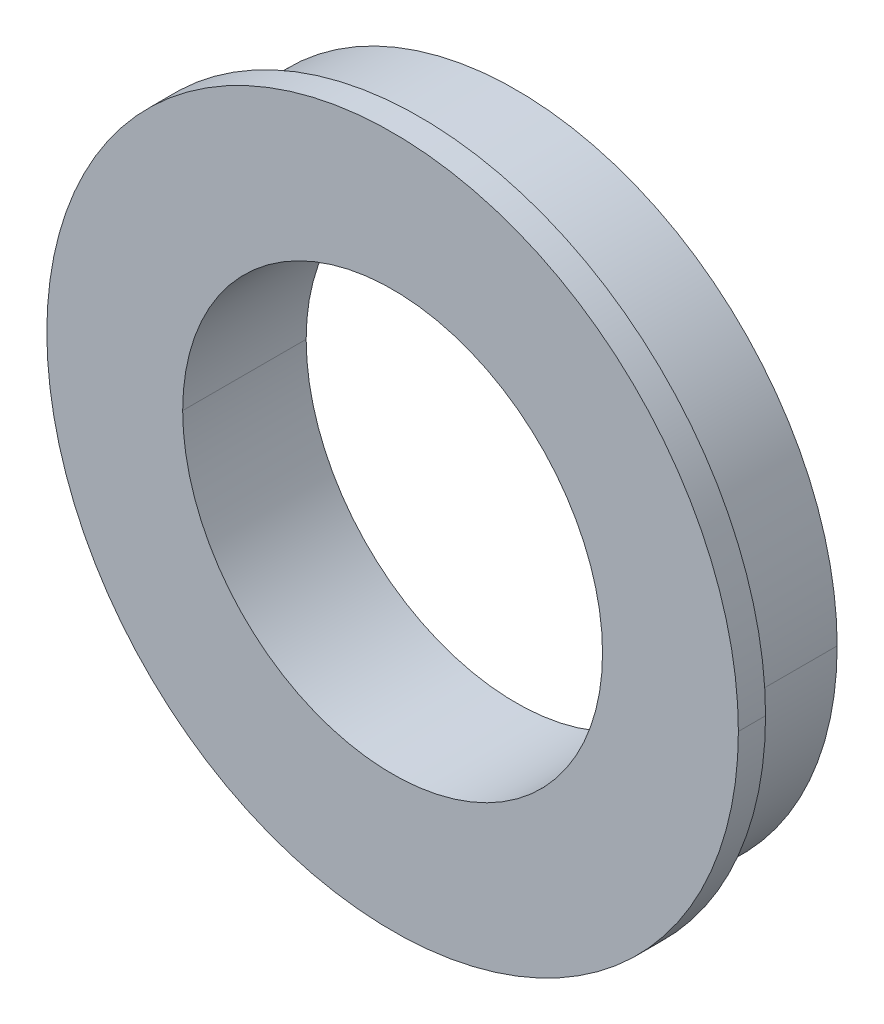
ISO-10303-21;
HEADER;
FILE_DESCRIPTION(('STEP AP214'),'2;1');
FILE_NAME('part.step','',(''),(''),'','','');
FILE_SCHEMA(('AUTOMOTIVE_DESIGN { 1 0 10303 214 1 1 1 1 }'));
ENDSEC;
DATA;
#1=APPLICATION_CONTEXT('core data for automotive mechanical design processes');
#2=APPLICATION_PROTOCOL_DEFINITION('international standard','automotive_design',2000,#1);
#3=PRODUCT_CONTEXT('',#1,'mechanical');
#4=PRODUCT('Part','Part','',(#3));
#5=PRODUCT_RELATED_PRODUCT_CATEGORY('part','',(#4));
#6=PRODUCT_DEFINITION_FORMATION('','',#4);
#7=PRODUCT_DEFINITION_CONTEXT('part definition',#1,'design');
#8=PRODUCT_DEFINITION('design','',#6,#7);
#9=PRODUCT_DEFINITION_SHAPE('','',#8);
#10=(LENGTH_UNIT() NAMED_UNIT(*) SI_UNIT(.MILLI.,.METRE.));
#11=(NAMED_UNIT(*) PLANE_ANGLE_UNIT() SI_UNIT($,.RADIAN.));
#12=(NAMED_UNIT(*) SI_UNIT($,.STERADIAN.) SOLID_ANGLE_UNIT());
#13=UNCERTAINTY_MEASURE_WITH_UNIT(LENGTH_MEASURE(1.E-05),#10,'distance_accuracy_value','');
#14=(GEOMETRIC_REPRESENTATION_CONTEXT(3) GLOBAL_UNCERTAINTY_ASSIGNED_CONTEXT((#13)) GLOBAL_UNIT_ASSIGNED_CONTEXT((#10,
#11,#12)) REPRESENTATION_CONTEXT('',''));
#15=CARTESIAN_POINT('',(0.,0.,0.));
#16=DIRECTION('',(0.,0.,1.));
#17=DIRECTION('',(1.,0.,0.));
#18=AXIS2_PLACEMENT_3D('',#15,#16,#17);
#19=CARTESIAN_POINT('',(0.,0.,3.9));
#20=DIRECTION('',(0.,0.,1.));
#21=DIRECTION('',(1.,0.,0.));
#22=AXIS2_PLACEMENT_3D('',#19,#20,#21);
#23=CYLINDRICAL_SURFACE('',#22,14.);
#24=DIRECTION('',(0.,0.,1.));
#25=VECTOR('',#24,1.);
#26=CARTESIAN_POINT('',(-14.,0.,3.9));
#27=LINE('',#26,#25);
#28=CARTESIAN_POINT('',(-14.,0.,3.9));
#29=VERTEX_POINT('',#28);
#30=CARTESIAN_POINT('',(-14.,0.,5.));
#31=VERTEX_POINT('',#30);
#32=EDGE_CURVE('E134',#29,#31,#27,.T.);
#33=ORIENTED_EDGE('',*,*,#32,.F.);
#34=CARTESIAN_POINT('',(0.,0.,3.9));
#35=DIRECTION('',(0.,0.,1.));
#36=DIRECTION('',(1.,0.,0.));
#37=AXIS2_PLACEMENT_3D('',#34,#35,#36);
#38=CIRCLE('',#37,14.);
#39=CARTESIAN_POINT('',(14.,0.,3.9));
#40=VERTEX_POINT('',#39);
#41=EDGE_CURVE('E9',#29,#40,#38,.T.);
#42=ORIENTED_EDGE('',*,*,#41,.T.);
#43=DIRECTION('',(0.,0.,1.));
#44=VECTOR('',#43,1.);
#45=CARTESIAN_POINT('',(14.,0.,3.9));
#46=LINE('',#45,#44);
#47=CARTESIAN_POINT('',(14.,0.,5.));
#48=VERTEX_POINT('',#47);
#49=EDGE_CURVE('E124',#40,#48,#46,.T.);
#50=ORIENTED_EDGE('',*,*,#49,.T.);
#51=CARTESIAN_POINT('',(0.,0.,5.));
#52=DIRECTION('',(0.,0.,1.));
#53=DIRECTION('',(1.,0.,0.));
#54=AXIS2_PLACEMENT_3D('',#51,#52,#53);
#55=CIRCLE('',#54,14.);
#56=EDGE_CURVE('E90',#31,#48,#55,.T.);
#57=ORIENTED_EDGE('',*,*,#56,.F.);
#58=EDGE_LOOP('',(#33,#42,#50,#57));
#59=FACE_BOUND('',#58,.T.);
#60=ADVANCED_FACE('F15',(#59),#23,.T.);
#61=CARTESIAN_POINT('',(0.,0.,3.9));
#62=DIRECTION('',(0.,0.,1.));
#63=DIRECTION('',(1.,0.,0.));
#64=AXIS2_PLACEMENT_3D('',#61,#62,#63);
#65=PLANE('',#64);
#66=CARTESIAN_POINT('',(0.,0.,3.9));
#67=DIRECTION('',(0.,0.,1.));
#68=DIRECTION('',(1.,0.,0.));
#69=AXIS2_PLACEMENT_3D('',#66,#67,#68);
#70=CIRCLE('',#69,13.);
#71=CARTESIAN_POINT('',(-13.,0.,3.9));
#72=VERTEX_POINT('',#71);
#73=CARTESIAN_POINT('',(13.,0.,3.9));
#74=VERTEX_POINT('',#73);
#75=EDGE_CURVE('E53',#72,#74,#70,.T.);
#76=ORIENTED_EDGE('',*,*,#75,.T.);
#77=CARTESIAN_POINT('',(0.,0.,3.9));
#78=DIRECTION('',(0.,0.,1.));
#79=DIRECTION('',(1.,0.,0.));
#80=AXIS2_PLACEMENT_3D('',#77,#78,#79);
#81=CIRCLE('',#80,13.);
#82=EDGE_CURVE('E67',#74,#72,#81,.T.);
#83=ORIENTED_EDGE('',*,*,#82,.T.);
#84=EDGE_LOOP('',(#76,#83));
#85=FACE_BOUND('',#84,.T.);
#86=CARTESIAN_POINT('',(0.,0.,3.9));
#87=DIRECTION('',(0.,0.,1.));
#88=DIRECTION('',(1.,0.,0.));
#89=AXIS2_PLACEMENT_3D('',#86,#87,#88);
#90=CIRCLE('',#89,14.);
#91=EDGE_CURVE('E138',#40,#29,#90,.T.);
#92=ORIENTED_EDGE('',*,*,#91,.F.);
#93=ORIENTED_EDGE('',*,*,#41,.F.);
#94=EDGE_LOOP('',(#92,#93));
#95=FACE_BOUND('',#94,.T.);
#96=ADVANCED_FACE('F17',(#85,#95),#65,.F.);
#97=CARTESIAN_POINT('',(0.,0.,5.));
#98=DIRECTION('',(0.,0.,-1.));
#99=DIRECTION('',(-1.,0.,0.));
#100=AXIS2_PLACEMENT_3D('',#97,#98,#99);
#101=CYLINDRICAL_SURFACE('',#100,8.5);
#102=DIRECTION('',(0.,0.,-1.));
#103=VECTOR('',#102,1.);
#104=CARTESIAN_POINT('',(8.5,0.,5.));
#105=LINE('',#104,#103);
#106=CARTESIAN_POINT('',(8.5,0.,5.));
#107=VERTEX_POINT('',#106);
#108=CARTESIAN_POINT('',(8.5,0.,0.));
#109=VERTEX_POINT('',#108);
#110=EDGE_CURVE('E117',#107,#109,#105,.T.);
#111=ORIENTED_EDGE('',*,*,#110,.F.);
#112=CARTESIAN_POINT('',(0.,0.,5.));
#113=DIRECTION('',(0.,0.,1.));
#114=DIRECTION('',(1.,0.,0.));
#115=AXIS2_PLACEMENT_3D('',#112,#113,#114);
#116=CIRCLE('',#115,8.5);
#117=CARTESIAN_POINT('',(-8.5,0.,5.));
#118=VERTEX_POINT('',#117);
#119=EDGE_CURVE('E91',#107,#118,#116,.T.);
#120=ORIENTED_EDGE('',*,*,#119,.T.);
#121=DIRECTION('',(0.,0.,-1.));
#122=VECTOR('',#121,1.);
#123=CARTESIAN_POINT('',(-8.5,0.,5.));
#124=LINE('',#123,#122);
#125=CARTESIAN_POINT('',(-8.5,0.,0.));
#126=VERTEX_POINT('',#125);
#127=EDGE_CURVE('E73',#118,#126,#124,.T.);
#128=ORIENTED_EDGE('',*,*,#127,.T.);
#129=CARTESIAN_POINT('',(0.,0.,0.));
#130=DIRECTION('',(0.,0.,1.));
#131=DIRECTION('',(1.,0.,0.));
#132=AXIS2_PLACEMENT_3D('',#129,#130,#131);
#133=CIRCLE('',#132,8.5);
#134=EDGE_CURVE('E25',#109,#126,#133,.T.);
#135=ORIENTED_EDGE('',*,*,#134,.F.);
#136=EDGE_LOOP('',(#111,#120,#128,#135));
#137=FACE_BOUND('',#136,.T.);
#138=ADVANCED_FACE('F110',(#137),#101,.F.);
#139=CARTESIAN_POINT('',(0.,0.,0.));
#140=DIRECTION('',(0.,0.,1.));
#141=DIRECTION('',(1.,0.,0.));
#142=AXIS2_PLACEMENT_3D('',#139,#140,#141);
#143=PLANE('',#142);
#144=CARTESIAN_POINT('',(0.,0.,0.));
#145=DIRECTION('',(0.,0.,1.));
#146=DIRECTION('',(1.,0.,0.));
#147=AXIS2_PLACEMENT_3D('',#144,#145,#146);
#148=CIRCLE('',#147,8.5);
#149=EDGE_CURVE('E81',#126,#109,#148,.T.);
#150=ORIENTED_EDGE('',*,*,#149,.T.);
#151=ORIENTED_EDGE('',*,*,#134,.T.);
#152=EDGE_LOOP('',(#150,#151));
#153=FACE_BOUND('',#152,.T.);
#154=CARTESIAN_POINT('',(0.,0.,0.));
#155=DIRECTION('',(0.,0.,1.));
#156=DIRECTION('',(1.,0.,0.));
#157=AXIS2_PLACEMENT_3D('',#154,#155,#156);
#158=CIRCLE('',#157,13.);
#159=CARTESIAN_POINT('',(-13.,0.,0.));
#160=VERTEX_POINT('',#159);
#161=CARTESIAN_POINT('',(13.,0.,0.));
#162=VERTEX_POINT('',#161);
#163=EDGE_CURVE('E37',#160,#162,#158,.T.);
#164=ORIENTED_EDGE('',*,*,#163,.F.);
#165=CARTESIAN_POINT('',(0.,0.,0.));
#166=DIRECTION('',(0.,0.,1.));
#167=DIRECTION('',(1.,0.,0.));
#168=AXIS2_PLACEMENT_3D('',#165,#166,#167);
#169=CIRCLE('',#168,13.);
#170=EDGE_CURVE('E68',#162,#160,#169,.T.);
#171=ORIENTED_EDGE('',*,*,#170,.F.);
#172=EDGE_LOOP('',(#164,#171));
#173=FACE_BOUND('',#172,.T.);
#174=ADVANCED_FACE('F103',(#153,#173),#143,.F.);
#175=CARTESIAN_POINT('',(0.,0.,5.));
#176=DIRECTION('',(0.,0.,1.));
#177=DIRECTION('',(1.,0.,0.));
#178=AXIS2_PLACEMENT_3D('',#175,#176,#177);
#179=PLANE('',#178);
#180=CARTESIAN_POINT('',(0.,0.,5.));
#181=DIRECTION('',(0.,0.,1.));
#182=DIRECTION('',(1.,0.,0.));
#183=AXIS2_PLACEMENT_3D('',#180,#181,#182);
#184=CIRCLE('',#183,8.5);
#185=EDGE_CURVE('E121',#118,#107,#184,.T.);
#186=ORIENTED_EDGE('',*,*,#185,.F.);
#187=ORIENTED_EDGE('',*,*,#119,.F.);
#188=EDGE_LOOP('',(#186,#187));
#189=FACE_BOUND('',#188,.T.);
#190=CARTESIAN_POINT('',(0.,0.,5.));
#191=DIRECTION('',(0.,0.,1.));
#192=DIRECTION('',(1.,0.,0.));
#193=AXIS2_PLACEMENT_3D('',#190,#191,#192);
#194=CIRCLE('',#193,14.);
#195=EDGE_CURVE('E130',#48,#31,#194,.T.);
#196=ORIENTED_EDGE('',*,*,#195,.T.);
#197=ORIENTED_EDGE('',*,*,#56,.T.);
#198=EDGE_LOOP('',(#196,#197));
#199=FACE_BOUND('',#198,.T.);
#200=ADVANCED_FACE('F294',(#189,#199),#179,.T.);
#201=CARTESIAN_POINT('',(0.,0.,5.));
#202=DIRECTION('',(0.,0.,-1.));
#203=DIRECTION('',(-1.,0.,0.));
#204=AXIS2_PLACEMENT_3D('',#201,#202,#203);
#205=CYLINDRICAL_SURFACE('',#204,13.);
#206=DIRECTION('',(0.,0.,-1.));
#207=VECTOR('',#206,1.);
#208=CARTESIAN_POINT('',(13.,0.,5.));
#209=LINE('',#208,#207);
#210=EDGE_CURVE('E59',#74,#162,#209,.T.);
#211=ORIENTED_EDGE('',*,*,#210,.F.);
#212=ORIENTED_EDGE('',*,*,#75,.F.);
#213=DIRECTION('',(0.,0.,-1.));
#214=VECTOR('',#213,1.);
#215=CARTESIAN_POINT('',(-13.,0.,5.));
#216=LINE('',#215,#214);
#217=EDGE_CURVE('E56',#72,#160,#216,.T.);
#218=ORIENTED_EDGE('',*,*,#217,.T.);
#219=ORIENTED_EDGE('',*,*,#163,.T.);
#220=EDGE_LOOP('',(#211,#212,#218,#219));
#221=FACE_BOUND('',#220,.T.);
#222=ADVANCED_FACE('F55',(#221),#205,.T.);
#223=CARTESIAN_POINT('',(0.,0.,5.));
#224=DIRECTION('',(0.,0.,-1.));
#225=DIRECTION('',(-1.,0.,0.));
#226=AXIS2_PLACEMENT_3D('',#223,#224,#225);
#227=CYLINDRICAL_SURFACE('',#226,13.);
#228=ORIENTED_EDGE('',*,*,#82,.F.);
#229=ORIENTED_EDGE('',*,*,#210,.T.);
#230=ORIENTED_EDGE('',*,*,#170,.T.);
#231=ORIENTED_EDGE('',*,*,#217,.F.);
#232=EDGE_LOOP('',(#228,#229,#230,#231));
#233=FACE_BOUND('',#232,.T.);
#234=ADVANCED_FACE('F66',(#233),#227,.T.);
#235=CARTESIAN_POINT('',(0.,0.,5.));
#236=DIRECTION('',(0.,0.,-1.));
#237=DIRECTION('',(-1.,0.,0.));
#238=AXIS2_PLACEMENT_3D('',#235,#236,#237);
#239=CYLINDRICAL_SURFACE('',#238,8.5);
#240=ORIENTED_EDGE('',*,*,#185,.T.);
#241=ORIENTED_EDGE('',*,*,#110,.T.);
#242=ORIENTED_EDGE('',*,*,#149,.F.);
#243=ORIENTED_EDGE('',*,*,#127,.F.);
#244=EDGE_LOOP('',(#240,#241,#242,#243));
#245=FACE_BOUND('',#244,.T.);
#246=ADVANCED_FACE('F116',(#245),#239,.F.);
#247=CARTESIAN_POINT('',(0.,0.,3.9));
#248=DIRECTION('',(0.,0.,1.));
#249=DIRECTION('',(1.,0.,0.));
#250=AXIS2_PLACEMENT_3D('',#247,#248,#249);
#251=CYLINDRICAL_SURFACE('',#250,14.);
#252=ORIENTED_EDGE('',*,*,#91,.T.);
#253=ORIENTED_EDGE('',*,*,#32,.T.);
#254=ORIENTED_EDGE('',*,*,#195,.F.);
#255=ORIENTED_EDGE('',*,*,#49,.F.);
#256=EDGE_LOOP('',(#252,#253,#254,#255));
#257=FACE_BOUND('',#256,.T.);
#258=ADVANCED_FACE('F146',(#257),#251,.T.);
#259=CLOSED_SHELL('',(#60,#96,#138,#174,#200,#222,#234,#246,#258));
#260=MANIFOLD_SOLID_BREP('B1',#259);
#261=ADVANCED_BREP_SHAPE_REPRESENTATION('',(#18,#260),#14);
#262=SHAPE_DEFINITION_REPRESENTATION(#9,#261);
ENDSEC;
END-ISO-10303-21;
